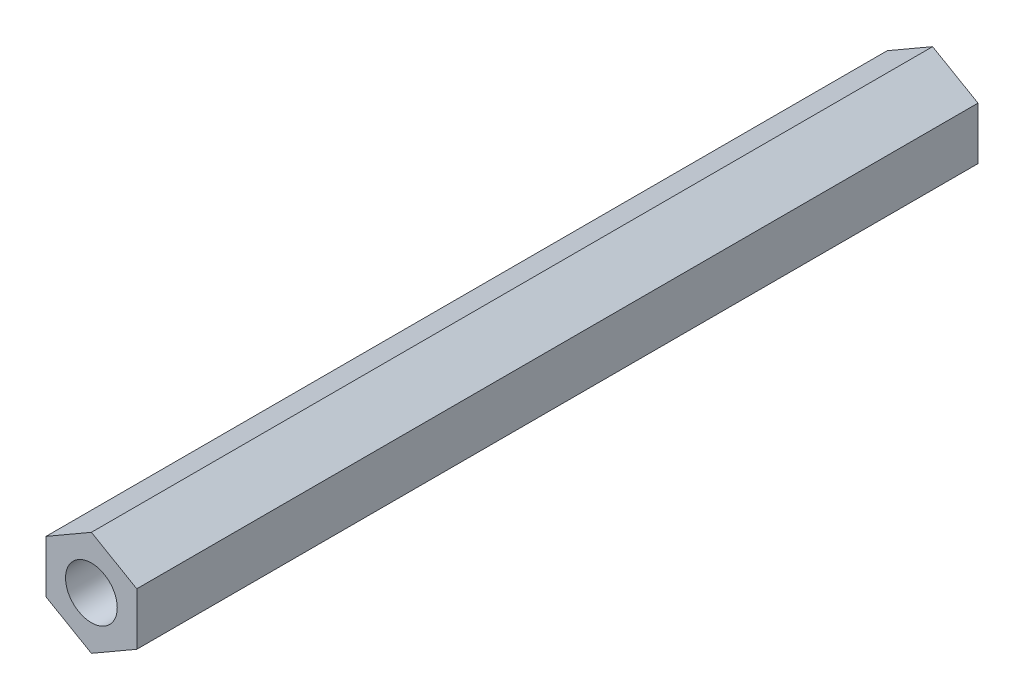
ISO-10303-21;
HEADER;
FILE_DESCRIPTION(('STEP AP214'),'2;1');
FILE_NAME('part.step','',(''),(''),'','','');
FILE_SCHEMA(('AUTOMOTIVE_DESIGN { 1 0 10303 214 1 1 1 1 }'));
ENDSEC;
DATA;
#1=APPLICATION_CONTEXT('core data for automotive mechanical design processes');
#2=APPLICATION_PROTOCOL_DEFINITION('international standard','automotive_design',2000,#1);
#3=PRODUCT_CONTEXT('',#1,'mechanical');
#4=PRODUCT('Part','Part','',(#3));
#5=PRODUCT_RELATED_PRODUCT_CATEGORY('part','',(#4));
#6=PRODUCT_DEFINITION_FORMATION('','',#4);
#7=PRODUCT_DEFINITION_CONTEXT('part definition',#1,'design');
#8=PRODUCT_DEFINITION('design','',#6,#7);
#9=PRODUCT_DEFINITION_SHAPE('','',#8);
#10=(LENGTH_UNIT() NAMED_UNIT(*) SI_UNIT(.MILLI.,.METRE.));
#11=(NAMED_UNIT(*) PLANE_ANGLE_UNIT() SI_UNIT($,.RADIAN.));
#12=(NAMED_UNIT(*) SI_UNIT($,.STERADIAN.) SOLID_ANGLE_UNIT());
#13=UNCERTAINTY_MEASURE_WITH_UNIT(LENGTH_MEASURE(1.E-05),#10,'distance_accuracy_value','');
#14=(GEOMETRIC_REPRESENTATION_CONTEXT(3) GLOBAL_UNCERTAINTY_ASSIGNED_CONTEXT((#13)) GLOBAL_UNIT_ASSIGNED_CONTEXT((#10,
#11,#12)) REPRESENTATION_CONTEXT('',''));
#15=CARTESIAN_POINT('',(0.,0.,0.));
#16=DIRECTION('',(0.,0.,1.));
#17=DIRECTION('',(1.,0.,0.));
#18=AXIS2_PLACEMENT_3D('',#15,#16,#17);
#19=CARTESIAN_POINT('',(1.75370144266349,3.0375,65.));
#20=DIRECTION('',(-0.5,-0.866025403784439,0.));
#21=DIRECTION('',(0.866025403784439,-0.5,0.));
#22=AXIS2_PLACEMENT_3D('',#19,#20,#21);
#23=PLANE('',#22);
#24=DIRECTION('',(-0.866025403784439,0.5,0.));
#25=VECTOR('',#24,1.);
#26=CARTESIAN_POINT('',(1.75370144266349,3.0375,0.));
#27=LINE('',#26,#25);
#28=CARTESIAN_POINT('',(3.50740288532697,2.025,0.));
#29=VERTEX_POINT('',#28);
#30=CARTESIAN_POINT('',(0.,4.05,0.));
#31=VERTEX_POINT('',#30);
#32=EDGE_CURVE('E129',#29,#31,#27,.T.);
#33=ORIENTED_EDGE('',*,*,#32,.T.);
#34=DIRECTION('',(0.,0.,-1.));
#35=VECTOR('',#34,1.);
#36=CARTESIAN_POINT('',(0.,4.05,65.));
#37=LINE('',#36,#35);
#38=CARTESIAN_POINT('',(0.,4.05,65.));
#39=VERTEX_POINT('',#38);
#40=EDGE_CURVE('E11',#39,#31,#37,.T.);
#41=ORIENTED_EDGE('',*,*,#40,.F.);
#42=DIRECTION('',(-0.866025403784439,0.5,0.));
#43=VECTOR('',#42,1.);
#44=CARTESIAN_POINT('',(1.75370144266349,3.0375,65.));
#45=LINE('',#44,#43);
#46=CARTESIAN_POINT('',(3.50740288532697,2.025,65.));
#47=VERTEX_POINT('',#46);
#48=EDGE_CURVE('E142',#47,#39,#45,.T.);
#49=ORIENTED_EDGE('',*,*,#48,.F.);
#50=DIRECTION('',(0.,0.,-1.));
#51=VECTOR('',#50,1.);
#52=CARTESIAN_POINT('',(3.50740288532697,2.025,65.));
#53=LINE('',#52,#51);
#54=EDGE_CURVE('E128',#47,#29,#53,.T.);
#55=ORIENTED_EDGE('',*,*,#54,.T.);
#56=EDGE_LOOP('',(#33,#41,#49,#55));
#57=FACE_BOUND('',#56,.T.);
#58=ADVANCED_FACE('F41',(#57),#23,.F.);
#59=CARTESIAN_POINT('',(-1.75370144266348,3.0375,65.));
#60=DIRECTION('',(0.499999999999999,-0.866025403784439,0.));
#61=DIRECTION('',(0.866025403784439,0.499999999999999,0.));
#62=AXIS2_PLACEMENT_3D('',#59,#60,#61);
#63=PLANE('',#62);
#64=DIRECTION('',(-0.86602540378444,-0.499999999999999,0.));
#65=VECTOR('',#64,1.);
#66=CARTESIAN_POINT('',(-1.75370144266348,3.0375,0.));
#67=LINE('',#66,#65);
#68=CARTESIAN_POINT('',(-3.50740288532698,2.025,0.));
#69=VERTEX_POINT('',#68);
#70=EDGE_CURVE('E132',#31,#69,#67,.T.);
#71=ORIENTED_EDGE('',*,*,#70,.T.);
#72=DIRECTION('',(0.,0.,-1.));
#73=VECTOR('',#72,1.);
#74=CARTESIAN_POINT('',(-3.50740288532698,2.025,65.));
#75=LINE('',#74,#73);
#76=CARTESIAN_POINT('',(-3.50740288532698,2.025,65.));
#77=VERTEX_POINT('',#76);
#78=EDGE_CURVE('E49',#77,#69,#75,.T.);
#79=ORIENTED_EDGE('',*,*,#78,.F.);
#80=DIRECTION('',(-0.86602540378444,-0.499999999999999,0.));
#81=VECTOR('',#80,1.);
#82=CARTESIAN_POINT('',(-1.75370144266348,3.0375,65.));
#83=LINE('',#82,#81);
#84=EDGE_CURVE('E94',#39,#77,#83,.T.);
#85=ORIENTED_EDGE('',*,*,#84,.F.);
#86=ORIENTED_EDGE('',*,*,#40,.T.);
#87=EDGE_LOOP('',(#71,#79,#85,#86));
#88=FACE_BOUND('',#87,.T.);
#89=ADVANCED_FACE('F168',(#88),#63,.F.);
#90=CARTESIAN_POINT('',(-3.50740288532698,0.,65.));
#91=DIRECTION('',(1.,0.,0.));
#92=DIRECTION('',(0.,0.,-1.));
#93=AXIS2_PLACEMENT_3D('',#90,#91,#92);
#94=PLANE('',#93);
#95=DIRECTION('',(0.,-1.,0.));
#96=VECTOR('',#95,1.);
#97=CARTESIAN_POINT('',(-3.50740288532698,0.,0.));
#98=LINE('',#97,#96);
#99=CARTESIAN_POINT('',(-3.50740288532698,-2.025,0.));
#100=VERTEX_POINT('',#99);
#101=EDGE_CURVE('E134',#69,#100,#98,.T.);
#102=ORIENTED_EDGE('',*,*,#101,.T.);
#103=DIRECTION('',(0.,0.,-1.));
#104=VECTOR('',#103,1.);
#105=CARTESIAN_POINT('',(-3.50740288532698,-2.025,65.));
#106=LINE('',#105,#104);
#107=CARTESIAN_POINT('',(-3.50740288532698,-2.025,65.));
#108=VERTEX_POINT('',#107);
#109=EDGE_CURVE('E117',#108,#100,#106,.T.);
#110=ORIENTED_EDGE('',*,*,#109,.F.);
#111=DIRECTION('',(0.,-1.,0.));
#112=VECTOR('',#111,1.);
#113=CARTESIAN_POINT('',(-3.50740288532698,0.,65.));
#114=LINE('',#113,#112);
#115=EDGE_CURVE('E108',#77,#108,#114,.T.);
#116=ORIENTED_EDGE('',*,*,#115,.F.);
#117=ORIENTED_EDGE('',*,*,#78,.T.);
#118=EDGE_LOOP('',(#102,#110,#116,#117));
#119=FACE_BOUND('',#118,.T.);
#120=ADVANCED_FACE('F148',(#119),#94,.F.);
#121=CARTESIAN_POINT('',(-1.75370144266348,-3.0375,65.));
#122=DIRECTION('',(0.499999999999999,0.866025403784439,0.));
#123=DIRECTION('',(-0.866025403784439,0.499999999999999,0.));
#124=AXIS2_PLACEMENT_3D('',#121,#122,#123);
#125=PLANE('',#124);
#126=DIRECTION('',(0.866025403784439,-0.499999999999999,0.));
#127=VECTOR('',#126,1.);
#128=CARTESIAN_POINT('',(-1.75370144266348,-3.0375,0.));
#129=LINE('',#128,#127);
#130=CARTESIAN_POINT('',(0.,-4.05,0.));
#131=VERTEX_POINT('',#130);
#132=EDGE_CURVE('E116',#100,#131,#129,.T.);
#133=ORIENTED_EDGE('',*,*,#132,.T.);
#134=DIRECTION('',(0.,0.,-1.));
#135=VECTOR('',#134,1.);
#136=CARTESIAN_POINT('',(0.,-4.05,65.));
#137=LINE('',#136,#135);
#138=CARTESIAN_POINT('',(0.,-4.05,65.));
#139=VERTEX_POINT('',#138);
#140=EDGE_CURVE('E113',#139,#131,#137,.T.);
#141=ORIENTED_EDGE('',*,*,#140,.F.);
#142=DIRECTION('',(0.866025403784439,-0.499999999999999,0.));
#143=VECTOR('',#142,1.);
#144=CARTESIAN_POINT('',(-1.75370144266348,-3.0375,65.));
#145=LINE('',#144,#143);
#146=EDGE_CURVE('E101',#108,#139,#145,.T.);
#147=ORIENTED_EDGE('',*,*,#146,.F.);
#148=ORIENTED_EDGE('',*,*,#109,.T.);
#149=EDGE_LOOP('',(#133,#141,#147,#148));
#150=FACE_BOUND('',#149,.T.);
#151=ADVANCED_FACE('F114',(#150),#125,.F.);
#152=CARTESIAN_POINT('',(1.75370144266349,-3.03750000000001,65.));
#153=DIRECTION('',(-0.499999999999999,0.866025403784439,0.));
#154=DIRECTION('',(-0.866025403784439,-0.499999999999999,0.));
#155=AXIS2_PLACEMENT_3D('',#152,#153,#154);
#156=PLANE('',#155);
#157=DIRECTION('',(0.866025403784439,0.499999999999999,0.));
#158=VECTOR('',#157,1.);
#159=CARTESIAN_POINT('',(1.75370144266349,-3.03750000000001,0.));
#160=LINE('',#159,#158);
#161=CARTESIAN_POINT('',(3.50740288532697,-2.02500000000001,0.));
#162=VERTEX_POINT('',#161);
#163=EDGE_CURVE('E80',#131,#162,#160,.T.);
#164=ORIENTED_EDGE('',*,*,#163,.T.);
#165=DIRECTION('',(0.,0.,-1.));
#166=VECTOR('',#165,1.);
#167=CARTESIAN_POINT('',(3.50740288532697,-2.02500000000001,65.));
#168=LINE('',#167,#166);
#169=CARTESIAN_POINT('',(3.50740288532697,-2.02500000000001,65.));
#170=VERTEX_POINT('',#169);
#171=EDGE_CURVE('E118',#170,#162,#168,.T.);
#172=ORIENTED_EDGE('',*,*,#171,.F.);
#173=DIRECTION('',(0.866025403784439,0.499999999999999,0.));
#174=VECTOR('',#173,1.);
#175=CARTESIAN_POINT('',(1.75370144266349,-3.03750000000001,65.));
#176=LINE('',#175,#174);
#177=EDGE_CURVE('E106',#139,#170,#176,.T.);
#178=ORIENTED_EDGE('',*,*,#177,.F.);
#179=ORIENTED_EDGE('',*,*,#140,.T.);
#180=EDGE_LOOP('',(#164,#172,#178,#179));
#181=FACE_BOUND('',#180,.T.);
#182=ADVANCED_FACE('F120',(#181),#156,.F.);
#183=CARTESIAN_POINT('',(3.50740288532697,0.,65.));
#184=DIRECTION('',(-1.,0.,0.));
#185=DIRECTION('',(0.,0.,1.));
#186=AXIS2_PLACEMENT_3D('',#183,#184,#185);
#187=PLANE('',#186);
#188=DIRECTION('',(0.,1.,0.));
#189=VECTOR('',#188,1.);
#190=CARTESIAN_POINT('',(3.50740288532697,0.,0.));
#191=LINE('',#190,#189);
#192=EDGE_CURVE('E86',#162,#29,#191,.T.);
#193=ORIENTED_EDGE('',*,*,#192,.T.);
#194=ORIENTED_EDGE('',*,*,#54,.F.);
#195=DIRECTION('',(0.,1.,0.));
#196=VECTOR('',#195,1.);
#197=CARTESIAN_POINT('',(3.50740288532697,0.,65.));
#198=LINE('',#197,#196);
#199=EDGE_CURVE('E57',#170,#47,#198,.T.);
#200=ORIENTED_EDGE('',*,*,#199,.F.);
#201=ORIENTED_EDGE('',*,*,#171,.T.);
#202=EDGE_LOOP('',(#193,#194,#200,#201));
#203=FACE_BOUND('',#202,.T.);
#204=ADVANCED_FACE('F156',(#203),#187,.F.);
#205=CARTESIAN_POINT('',(0.,0.,65.));
#206=DIRECTION('',(0.,0.,-1.));
#207=DIRECTION('',(-1.,0.,0.));
#208=AXIS2_PLACEMENT_3D('',#205,#206,#207);
#209=CYLINDRICAL_SURFACE('',#208,2.);
#210=CARTESIAN_POINT('',(0.,0.,65.));
#211=DIRECTION('',(0.,0.,1.));
#212=DIRECTION('',(1.,0.,0.));
#213=AXIS2_PLACEMENT_3D('',#210,#211,#212);
#214=CIRCLE('',#213,2.);
#215=CARTESIAN_POINT('',(2.,0.,65.));
#216=VERTEX_POINT('',#215);
#217=EDGE_CURVE('E122',#216,#216,#214,.T.);
#218=ORIENTED_EDGE('',*,*,#217,.T.);
#219=EDGE_LOOP('',(#218));
#220=FACE_BOUND('',#219,.T.);
#221=CARTESIAN_POINT('',(0.,0.,0.));
#222=DIRECTION('',(0.,0.,1.));
#223=DIRECTION('',(1.,0.,0.));
#224=AXIS2_PLACEMENT_3D('',#221,#222,#223);
#225=CIRCLE('',#224,2.);
#226=CARTESIAN_POINT('',(2.,0.,0.));
#227=VERTEX_POINT('',#226);
#228=EDGE_CURVE('E139',#227,#227,#225,.T.);
#229=ORIENTED_EDGE('',*,*,#228,.F.);
#230=EDGE_LOOP('',(#229));
#231=FACE_BOUND('',#230,.T.);
#232=ADVANCED_FACE('F158',(#220,#231),#209,.F.);
#233=CARTESIAN_POINT('',(0.,0.,65.));
#234=DIRECTION('',(0.,0.,1.));
#235=DIRECTION('',(1.,0.,0.));
#236=AXIS2_PLACEMENT_3D('',#233,#234,#235);
#237=PLANE('',#236);
#238=ORIENTED_EDGE('',*,*,#48,.T.);
#239=ORIENTED_EDGE('',*,*,#84,.T.);
#240=ORIENTED_EDGE('',*,*,#115,.T.);
#241=ORIENTED_EDGE('',*,*,#146,.T.);
#242=ORIENTED_EDGE('',*,*,#177,.T.);
#243=ORIENTED_EDGE('',*,*,#199,.T.);
#244=EDGE_LOOP('',(#238,#239,#240,#241,#242,#243));
#245=FACE_BOUND('',#244,.T.);
#246=ORIENTED_EDGE('',*,*,#217,.F.);
#247=EDGE_LOOP('',(#246));
#248=FACE_BOUND('',#247,.T.);
#249=ADVANCED_FACE('F103',(#245,#248),#237,.T.);
#250=CARTESIAN_POINT('',(0.,0.,0.));
#251=DIRECTION('',(0.,0.,1.));
#252=DIRECTION('',(1.,0.,0.));
#253=AXIS2_PLACEMENT_3D('',#250,#251,#252);
#254=PLANE('',#253);
#255=ORIENTED_EDGE('',*,*,#32,.F.);
#256=ORIENTED_EDGE('',*,*,#192,.F.);
#257=ORIENTED_EDGE('',*,*,#163,.F.);
#258=ORIENTED_EDGE('',*,*,#132,.F.);
#259=ORIENTED_EDGE('',*,*,#101,.F.);
#260=ORIENTED_EDGE('',*,*,#70,.F.);
#261=EDGE_LOOP('',(#255,#256,#257,#258,#259,#260));
#262=FACE_BOUND('',#261,.T.);
#263=ORIENTED_EDGE('',*,*,#228,.T.);
#264=EDGE_LOOP('',(#263));
#265=FACE_BOUND('',#264,.T.);
#266=ADVANCED_FACE('F151',(#262,#265),#254,.F.);
#267=CLOSED_SHELL('',(#58,#89,#120,#151,#182,#204,#232,#249,#266));
#268=MANIFOLD_SOLID_BREP('B2',#267);
#269=ADVANCED_BREP_SHAPE_REPRESENTATION('',(#18,#268),#14);
#270=SHAPE_DEFINITION_REPRESENTATION(#9,#269);
ENDSEC;
END-ISO-10303-21;
